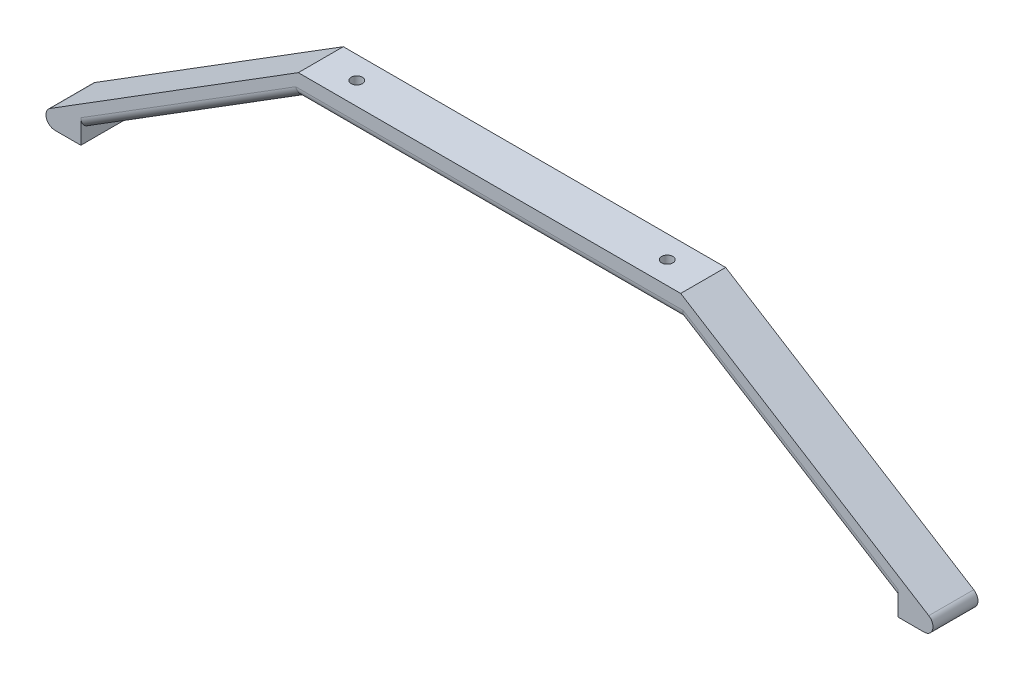
ISO-10303-21;
HEADER;
FILE_DESCRIPTION(('STEP AP214'),'2;1');
FILE_NAME('part.step','',(''),(''),'','','');
FILE_SCHEMA(('AUTOMOTIVE_DESIGN { 1 0 10303 214 1 1 1 1 }'));
ENDSEC;
DATA;
#1=APPLICATION_CONTEXT('core data for automotive mechanical design processes');
#2=APPLICATION_PROTOCOL_DEFINITION('international standard','automotive_design',2000,#1);
#3=PRODUCT_CONTEXT('',#1,'mechanical');
#4=PRODUCT('Part','Part','',(#3));
#5=PRODUCT_RELATED_PRODUCT_CATEGORY('part','',(#4));
#6=PRODUCT_DEFINITION_FORMATION('','',#4);
#7=PRODUCT_DEFINITION_CONTEXT('part definition',#1,'design');
#8=PRODUCT_DEFINITION('design','',#6,#7);
#9=PRODUCT_DEFINITION_SHAPE('','',#8);
#10=(LENGTH_UNIT() NAMED_UNIT(*) SI_UNIT(.MILLI.,.METRE.));
#11=(NAMED_UNIT(*) PLANE_ANGLE_UNIT() SI_UNIT($,.RADIAN.));
#12=(NAMED_UNIT(*) SI_UNIT($,.STERADIAN.) SOLID_ANGLE_UNIT());
#13=UNCERTAINTY_MEASURE_WITH_UNIT(LENGTH_MEASURE(1.E-05),#10,'distance_accuracy_value','');
#14=(GEOMETRIC_REPRESENTATION_CONTEXT(3) GLOBAL_UNCERTAINTY_ASSIGNED_CONTEXT((#13)) GLOBAL_UNIT_ASSIGNED_CONTEXT((#10,
#11,#12)) REPRESENTATION_CONTEXT('',''));
#15=CARTESIAN_POINT('',(0.,0.,0.));
#16=DIRECTION('',(0.,0.,1.));
#17=DIRECTION('',(1.,0.,0.));
#18=AXIS2_PLACEMENT_3D('',#15,#16,#17);
#19=CARTESIAN_POINT('',(0.,0.,10.));
#20=DIRECTION('',(0.5299192642332,-0.848048096156429,0.));
#21=DIRECTION('',(0.848048096156429,0.5299192642332,0.));
#22=AXIS2_PLACEMENT_3D('',#19,#20,#21);
#23=PLANE('',#22);
#24=DIRECTION('',(-0.848048096156429,-0.5299192642332,0.));
#25=VECTOR('',#24,1.);
#26=CARTESIAN_POINT('',(0.,0.,0.));
#27=LINE('',#26,#25);
#28=CARTESIAN_POINT('',(0.,0.,0.));
#29=VERTEX_POINT('',#28);
#30=CARTESIAN_POINT('',(-55.1444725640473,-34.4580908324775,0.));
#31=VERTEX_POINT('',#30);
#32=EDGE_CURVE('E187',#29,#31,#27,.T.);
#33=ORIENTED_EDGE('',*,*,#32,.T.);
#34=DIRECTION('',(0.,0.,-1.));
#35=VECTOR('',#34,1.);
#36=CARTESIAN_POINT('',(-55.1444725640474,-34.4580908324775,10.));
#37=LINE('',#36,#35);
#38=CARTESIAN_POINT('',(-55.1444725640473,-34.4580908324775,10.));
#39=VERTEX_POINT('',#38);
#40=EDGE_CURVE('E272',#31,#39,#37,.F.);
#41=ORIENTED_EDGE('',*,*,#40,.T.);
#42=DIRECTION('',(-0.848048096156429,-0.5299192642332,0.));
#43=VECTOR('',#42,1.);
#44=CARTESIAN_POINT('',(0.,0.,10.));
#45=LINE('',#44,#43);
#46=CARTESIAN_POINT('',(0.,0.,10.));
#47=VERTEX_POINT('',#46);
#48=EDGE_CURVE('E158',#47,#39,#45,.T.);
#49=ORIENTED_EDGE('',*,*,#48,.F.);
#50=DIRECTION('',(0.,0.,-1.));
#51=VECTOR('',#50,1.);
#52=CARTESIAN_POINT('',(0.,0.,10.));
#53=LINE('',#52,#51);
#54=EDGE_CURVE('E186',#47,#29,#53,.T.);
#55=ORIENTED_EDGE('',*,*,#54,.T.);
#56=EDGE_LOOP('',(#33,#41,#49,#55));
#57=FACE_BOUND('',#56,.T.);
#58=ADVANCED_FACE('F33',(#57),#23,.F.);
#59=CARTESIAN_POINT('',(-61.0594629232629,-38.1541870247904,10.));
#60=DIRECTION('',(0.,1.,0.));
#61=DIRECTION('',(0.,0.,1.));
#62=AXIS2_PLACEMENT_3D('',#59,#60,#61);
#63=PLANE('',#62);
#64=DIRECTION('',(1.,0.,0.));
#65=VECTOR('',#64,1.);
#66=CARTESIAN_POINT('',(-61.0594629232629,-38.1541870247904,10.));
#67=LINE('',#66,#65);
#68=CARTESIAN_POINT('',(-54.084634035581,-38.1541870247904,10.));
#69=VERTEX_POINT('',#68);
#70=CARTESIAN_POINT('',(-48.3387414809165,-38.1541870247904,10.));
#71=VERTEX_POINT('',#70);
#72=EDGE_CURVE('E145',#69,#71,#67,.T.);
#73=ORIENTED_EDGE('',*,*,#72,.F.);
#74=DIRECTION('',(0.,0.,-1.));
#75=VECTOR('',#74,1.);
#76=CARTESIAN_POINT('',(-54.084634035581,-38.1541870247904,10.));
#77=LINE('',#76,#75);
#78=CARTESIAN_POINT('',(-54.084634035581,-38.1541870247904,0.));
#79=VERTEX_POINT('',#78);
#80=EDGE_CURVE('E261',#69,#79,#77,.T.);
#81=ORIENTED_EDGE('',*,*,#80,.T.);
#82=DIRECTION('',(1.,0.,0.));
#83=VECTOR('',#82,1.);
#84=CARTESIAN_POINT('',(-61.0594629232629,-38.1541870247904,0.));
#85=LINE('',#84,#83);
#86=CARTESIAN_POINT('',(-48.3387414809165,-38.1541870247904,0.));
#87=VERTEX_POINT('',#86);
#88=EDGE_CURVE('E164',#79,#87,#85,.T.);
#89=ORIENTED_EDGE('',*,*,#88,.T.);
#90=DIRECTION('',(0.,0.,-1.));
#91=VECTOR('',#90,1.);
#92=CARTESIAN_POINT('',(-48.3387414809165,-38.1541870247904,10.));
#93=LINE('',#92,#91);
#94=EDGE_CURVE('E161',#71,#87,#93,.T.);
#95=ORIENTED_EDGE('',*,*,#94,.F.);
#96=EDGE_LOOP('',(#73,#81,#89,#95));
#97=FACE_BOUND('',#96,.T.);
#98=ADVANCED_FACE('F162',(#97),#63,.F.);
#99=CARTESIAN_POINT('',(-48.3387414809165,-38.1541870247904,10.));
#100=DIRECTION('',(-1.,0.,0.));
#101=DIRECTION('',(0.,0.,1.));
#102=AXIS2_PLACEMENT_3D('',#99,#100,#101);
#103=PLANE('',#102);
#104=DIRECTION('',(0.,1.,0.));
#105=VECTOR('',#104,1.);
#106=CARTESIAN_POINT('',(-48.3387414809165,-38.1541870247904,0.));
#107=LINE('',#106,#105);
#108=CARTESIAN_POINT('',(-48.3387414809165,-32.8470412545682,0.));
#109=VERTEX_POINT('',#108);
#110=EDGE_CURVE('E192',#87,#109,#107,.T.);
#111=ORIENTED_EDGE('',*,*,#110,.T.);
#112=CARTESIAN_POINT('',(-48.3387414809165,-32.8470412545682,2.));
#113=DIRECTION('',(-1.,0.,0.));
#114=DIRECTION('',(0.,1.,0.));
#115=AXIS2_PLACEMENT_3D('',#112,#113,#114);
#116=ELLIPSE('',#115,2.35835680672418,2.);
#117=CARTESIAN_POINT('',(-48.3387414809165,-35.2053980612924,2.));
#118=VERTEX_POINT('',#117);
#119=EDGE_CURVE('E259',#109,#118,#116,.T.);
#120=ORIENTED_EDGE('',*,*,#119,.T.);
#121=DIRECTION('',(0.,0.,-1.));
#122=VECTOR('',#121,1.);
#123=CARTESIAN_POINT('',(-48.3387414809165,-35.2053980612924,10.));
#124=LINE('',#123,#122);
#125=CARTESIAN_POINT('',(-48.3387414809165,-35.2053980612924,8.));
#126=VERTEX_POINT('',#125);
#127=EDGE_CURVE('E168',#126,#118,#124,.T.);
#128=ORIENTED_EDGE('',*,*,#127,.F.);
#129=CARTESIAN_POINT('',(-48.3387414809165,-32.8470412545682,8.));
#130=DIRECTION('',(-1.,0.,0.));
#131=DIRECTION('',(0.,-1.,0.));
#132=AXIS2_PLACEMENT_3D('',#129,#130,#131);
#133=ELLIPSE('',#132,2.35835680672418,2.);
#134=CARTESIAN_POINT('',(-48.3387414809165,-32.8470412545682,10.));
#135=VERTEX_POINT('',#134);
#136=EDGE_CURVE('E173',#126,#135,#133,.T.);
#137=ORIENTED_EDGE('',*,*,#136,.T.);
#138=DIRECTION('',(0.,1.,0.));
#139=VECTOR('',#138,1.);
#140=CARTESIAN_POINT('',(-48.3387414809165,-38.1541870247904,10.));
#141=LINE('',#140,#139);
#142=EDGE_CURVE('E150',#71,#135,#141,.T.);
#143=ORIENTED_EDGE('',*,*,#142,.F.);
#144=ORIENTED_EDGE('',*,*,#94,.T.);
#145=EDGE_LOOP('',(#111,#120,#128,#137,#143,#144));
#146=FACE_BOUND('',#145,.T.);
#147=ADVANCED_FACE('F170',(#146),#103,.F.);
#148=CARTESIAN_POINT('',(0.,-5.,10.));
#149=DIRECTION('',(-0.5299192642332,0.848048096156429,0.));
#150=DIRECTION('',(-0.848048096156429,-0.5299192642332,0.));
#151=AXIS2_PLACEMENT_3D('',#148,#149,#150);
#152=PLANE('',#151);
#153=DIRECTION('',(0.,0.,-1.));
#154=VECTOR('',#153,1.);
#155=CARTESIAN_POINT('',(0.,-5.,10.));
#156=LINE('',#155,#154);
#157=CARTESIAN_POINT('',(0.,-5.,8.));
#158=VERTEX_POINT('',#157);
#159=CARTESIAN_POINT('',(0.,-5.,2.));
#160=VERTEX_POINT('',#159);
#161=EDGE_CURVE('E216',#158,#160,#156,.T.);
#162=ORIENTED_EDGE('',*,*,#161,.F.);
#163=DIRECTION('',(0.848048096156429,0.5299192642332,0.));
#164=VECTOR('',#163,1.);
#165=CARTESIAN_POINT('',(-48.3387414809165,-35.2053980612924,8.));
#166=LINE('',#165,#164);
#167=EDGE_CURVE('E244',#158,#126,#166,.F.);
#168=ORIENTED_EDGE('',*,*,#167,.T.);
#169=ORIENTED_EDGE('',*,*,#127,.T.);
#170=DIRECTION('',(0.848048096156429,0.5299192642332,0.));
#171=VECTOR('',#170,1.);
#172=CARTESIAN_POINT('',(0.,-5.,2.));
#173=LINE('',#172,#171);
#174=EDGE_CURVE('E242',#118,#160,#173,.T.);
#175=ORIENTED_EDGE('',*,*,#174,.T.);
#176=EDGE_LOOP('',(#162,#168,#169,#175));
#177=FACE_BOUND('',#176,.T.);
#178=ADVANCED_FACE('F325',(#177),#152,.F.);
#179=CARTESIAN_POINT('',(0.,-5.,10.));
#180=DIRECTION('',(0.,1.,0.));
#181=DIRECTION('',(0.,0.,1.));
#182=AXIS2_PLACEMENT_3D('',#179,#180,#181);
#183=PLANE('',#182);
#184=CARTESIAN_POINT('',(8.,-5.,5.));
#185=DIRECTION('',(0.,1.,0.));
#186=DIRECTION('',(0.,0.,1.));
#187=AXIS2_PLACEMENT_3D('',#184,#185,#186);
#188=CIRCLE('',#187,1.25);
#189=CARTESIAN_POINT('',(8.,-5.,6.25));
#190=VERTEX_POINT('',#189);
#191=EDGE_CURVE('E301',#190,#190,#188,.T.);
#192=ORIENTED_EDGE('',*,*,#191,.T.);
#193=EDGE_LOOP('',(#192));
#194=FACE_BOUND('',#193,.T.);
#195=CARTESIAN_POINT('',(77.,-5.,5.));
#196=DIRECTION('',(0.,1.,0.));
#197=DIRECTION('',(0.,0.,1.));
#198=AXIS2_PLACEMENT_3D('',#195,#196,#197);
#199=CIRCLE('',#198,1.25);
#200=CARTESIAN_POINT('',(77.,-5.,6.25));
#201=VERTEX_POINT('',#200);
#202=EDGE_CURVE('E190',#201,#201,#199,.T.);
#203=ORIENTED_EDGE('',*,*,#202,.T.);
#204=EDGE_LOOP('',(#203));
#205=FACE_BOUND('',#204,.T.);
#206=ORIENTED_EDGE('',*,*,#161,.T.);
#207=DIRECTION('',(1.,0.,0.));
#208=VECTOR('',#207,1.);
#209=CARTESIAN_POINT('',(0.,-5.,2.));
#210=LINE('',#209,#208);
#211=CARTESIAN_POINT('',(85.,-5.,2.));
#212=VERTEX_POINT('',#211);
#213=EDGE_CURVE('E246',#160,#212,#210,.T.);
#214=ORIENTED_EDGE('',*,*,#213,.T.);
#215=DIRECTION('',(0.,0.,-1.));
#216=VECTOR('',#215,1.);
#217=CARTESIAN_POINT('',(85.,-5.,10.));
#218=LINE('',#217,#216);
#219=CARTESIAN_POINT('',(85.,-5.,8.));
#220=VERTEX_POINT('',#219);
#221=EDGE_CURVE('E213',#220,#212,#218,.T.);
#222=ORIENTED_EDGE('',*,*,#221,.F.);
#223=DIRECTION('',(1.,0.,0.));
#224=VECTOR('',#223,1.);
#225=CARTESIAN_POINT('',(0.,-5.,8.));
#226=LINE('',#225,#224);
#227=EDGE_CURVE('E222',#220,#158,#226,.F.);
#228=ORIENTED_EDGE('',*,*,#227,.T.);
#229=EDGE_LOOP('',(#206,#214,#222,#228));
#230=FACE_BOUND('',#229,.T.);
#231=ADVANCED_FACE('F321',(#194,#205,#230),#183,.F.);
#232=CARTESIAN_POINT('',(85.,-5.,10.));
#233=DIRECTION('',(0.529919264233206,0.848048096156425,0.));
#234=DIRECTION('',(-0.848048096156425,0.529919264233206,0.));
#235=AXIS2_PLACEMENT_3D('',#232,#233,#234);
#236=PLANE('',#235);
#237=DIRECTION('',(0.,0.,-1.));
#238=VECTOR('',#237,1.);
#239=CARTESIAN_POINT('',(133.338741480916,-35.2053980612927,10.));
#240=LINE('',#239,#238);
#241=CARTESIAN_POINT('',(133.338741480916,-35.2053980612927,8.));
#242=VERTEX_POINT('',#241);
#243=CARTESIAN_POINT('',(133.338741480916,-35.2053980612927,2.));
#244=VERTEX_POINT('',#243);
#245=EDGE_CURVE('E210',#242,#244,#240,.T.);
#246=ORIENTED_EDGE('',*,*,#245,.F.);
#247=DIRECTION('',(0.848048096156425,-0.529919264233206,0.));
#248=VECTOR('',#247,1.);
#249=CARTESIAN_POINT('',(81.7993309419179,-3.,8.));
#250=LINE('',#249,#248);
#251=EDGE_CURVE('E233',#242,#220,#250,.F.);
#252=ORIENTED_EDGE('',*,*,#251,.T.);
#253=ORIENTED_EDGE('',*,*,#221,.T.);
#254=DIRECTION('',(0.848048096156425,-0.529919264233206,0.));
#255=VECTOR('',#254,1.);
#256=CARTESIAN_POINT('',(85.,-5.,2.));
#257=LINE('',#256,#255);
#258=EDGE_CURVE('E230',#212,#244,#257,.T.);
#259=ORIENTED_EDGE('',*,*,#258,.T.);
#260=EDGE_LOOP('',(#246,#252,#253,#259));
#261=FACE_BOUND('',#260,.T.);
#262=ADVANCED_FACE('F324',(#261),#236,.F.);
#263=CARTESIAN_POINT('',(133.338741480916,-35.2053980612927,10.));
#264=DIRECTION('',(1.,0.,0.));
#265=DIRECTION('',(0.,0.,-1.));
#266=AXIS2_PLACEMENT_3D('',#263,#264,#265);
#267=PLANE('',#266);
#268=DIRECTION('',(0.,-1.,0.));
#269=VECTOR('',#268,1.);
#270=CARTESIAN_POINT('',(133.338741480916,-35.2053980612927,0.));
#271=LINE('',#270,#269);
#272=CARTESIAN_POINT('',(133.338741480916,-32.8470412545685,0.));
#273=VERTEX_POINT('',#272);
#274=CARTESIAN_POINT('',(133.338741480916,-38.1541870247908,0.));
#275=VERTEX_POINT('',#274);
#276=EDGE_CURVE('E194',#273,#275,#271,.T.);
#277=ORIENTED_EDGE('',*,*,#276,.T.);
#278=DIRECTION('',(0.,0.,-1.));
#279=VECTOR('',#278,1.);
#280=CARTESIAN_POINT('',(133.338741480916,-38.1541870247908,10.));
#281=LINE('',#280,#279);
#282=CARTESIAN_POINT('',(133.338741480916,-38.1541870247908,10.));
#283=VERTEX_POINT('',#282);
#284=EDGE_CURVE('E207',#283,#275,#281,.T.);
#285=ORIENTED_EDGE('',*,*,#284,.F.);
#286=DIRECTION('',(0.,-1.,0.));
#287=VECTOR('',#286,1.);
#288=CARTESIAN_POINT('',(133.338741480916,-35.2053980612927,10.));
#289=LINE('',#288,#287);
#290=CARTESIAN_POINT('',(133.338741480916,-32.8470412545685,10.));
#291=VERTEX_POINT('',#290);
#292=EDGE_CURVE('E175',#291,#283,#289,.T.);
#293=ORIENTED_EDGE('',*,*,#292,.F.);
#294=CARTESIAN_POINT('',(133.338741480916,-32.8470412545685,8.));
#295=DIRECTION('',(1.,0.,0.));
#296=DIRECTION('',(0.,1.,0.));
#297=AXIS2_PLACEMENT_3D('',#294,#295,#296);
#298=ELLIPSE('',#297,2.35835680672419,2.);
#299=EDGE_CURVE('E248',#291,#242,#298,.T.);
#300=ORIENTED_EDGE('',*,*,#299,.T.);
#301=ORIENTED_EDGE('',*,*,#245,.T.);
#302=CARTESIAN_POINT('',(133.338741480916,-32.8470412545685,2.));
#303=DIRECTION('',(1.,0.,0.));
#304=DIRECTION('',(0.,-1.,0.));
#305=AXIS2_PLACEMENT_3D('',#302,#303,#304);
#306=ELLIPSE('',#305,2.35835680672419,2.);
#307=EDGE_CURVE('E253',#244,#273,#306,.T.);
#308=ORIENTED_EDGE('',*,*,#307,.T.);
#309=EDGE_LOOP('',(#277,#285,#293,#300,#301,#308));
#310=FACE_BOUND('',#309,.T.);
#311=ADVANCED_FACE('F352',(#310),#267,.F.);
#312=CARTESIAN_POINT('',(133.338741480916,-38.1541870247908,10.));
#313=DIRECTION('',(0.,1.,0.));
#314=DIRECTION('',(-1.,0.,0.));
#315=AXIS2_PLACEMENT_3D('',#312,#313,#314);
#316=PLANE('',#315);
#317=DIRECTION('',(1.,0.,0.));
#318=VECTOR('',#317,1.);
#319=CARTESIAN_POINT('',(133.338741480916,-38.1541870247908,0.));
#320=LINE('',#319,#318);
#321=CARTESIAN_POINT('',(139.084634035581,-38.1541870247908,0.));
#322=VERTEX_POINT('',#321);
#323=EDGE_CURVE('E196',#275,#322,#320,.T.);
#324=ORIENTED_EDGE('',*,*,#323,.T.);
#325=DIRECTION('',(0.,0.,-1.));
#326=VECTOR('',#325,1.);
#327=CARTESIAN_POINT('',(139.084634035581,-38.1541870247908,10.));
#328=LINE('',#327,#326);
#329=CARTESIAN_POINT('',(139.084634035581,-38.1541870247908,10.));
#330=VERTEX_POINT('',#329);
#331=EDGE_CURVE('E41',#322,#330,#328,.F.);
#332=ORIENTED_EDGE('',*,*,#331,.T.);
#333=DIRECTION('',(1.,0.,0.));
#334=VECTOR('',#333,1.);
#335=CARTESIAN_POINT('',(133.338741480916,-38.1541870247908,10.));
#336=LINE('',#335,#334);
#337=EDGE_CURVE('E177',#283,#330,#336,.T.);
#338=ORIENTED_EDGE('',*,*,#337,.F.);
#339=ORIENTED_EDGE('',*,*,#284,.T.);
#340=EDGE_LOOP('',(#324,#332,#338,#339));
#341=FACE_BOUND('',#340,.T.);
#342=ADVANCED_FACE('F364',(#341),#316,.F.);
#343=CARTESIAN_POINT('',(85.,0.,10.));
#344=DIRECTION('',(-0.529919264233206,-0.848048096156425,0.));
#345=DIRECTION('',(0.848048096156425,-0.529919264233206,0.));
#346=AXIS2_PLACEMENT_3D('',#343,#344,#345);
#347=PLANE('',#346);
#348=DIRECTION('',(-0.848048096156425,0.529919264233206,0.));
#349=VECTOR('',#348,1.);
#350=CARTESIAN_POINT('',(85.,0.,10.));
#351=LINE('',#350,#349);
#352=CARTESIAN_POINT('',(140.144472564047,-34.458090832478,10.));
#353=VERTEX_POINT('',#352);
#354=CARTESIAN_POINT('',(85.,0.,10.));
#355=VERTEX_POINT('',#354);
#356=EDGE_CURVE('E182',#353,#355,#351,.T.);
#357=ORIENTED_EDGE('',*,*,#356,.F.);
#358=DIRECTION('',(0.,0.,-1.));
#359=VECTOR('',#358,1.);
#360=CARTESIAN_POINT('',(140.144472564047,-34.458090832478,10.));
#361=LINE('',#360,#359);
#362=CARTESIAN_POINT('',(140.144472564047,-34.458090832478,0.));
#363=VERTEX_POINT('',#362);
#364=EDGE_CURVE('E275',#353,#363,#361,.T.);
#365=ORIENTED_EDGE('',*,*,#364,.T.);
#366=DIRECTION('',(-0.848048096156425,0.529919264233206,0.));
#367=VECTOR('',#366,1.);
#368=CARTESIAN_POINT('',(85.,0.,0.));
#369=LINE('',#368,#367);
#370=CARTESIAN_POINT('',(85.,0.,0.));
#371=VERTEX_POINT('',#370);
#372=EDGE_CURVE('E198',#363,#371,#369,.T.);
#373=ORIENTED_EDGE('',*,*,#372,.T.);
#374=DIRECTION('',(0.,0.,-1.));
#375=VECTOR('',#374,1.);
#376=CARTESIAN_POINT('',(85.,0.,10.));
#377=LINE('',#376,#375);
#378=EDGE_CURVE('E204',#355,#371,#377,.T.);
#379=ORIENTED_EDGE('',*,*,#378,.F.);
#380=EDGE_LOOP('',(#357,#365,#373,#379));
#381=FACE_BOUND('',#380,.T.);
#382=ADVANCED_FACE('F281',(#381),#347,.F.);
#383=CARTESIAN_POINT('',(0.,0.,10.));
#384=DIRECTION('',(0.,-1.,0.));
#385=DIRECTION('',(0.,0.,-1.));
#386=AXIS2_PLACEMENT_3D('',#383,#384,#385);
#387=PLANE('',#386);
#388=CARTESIAN_POINT('',(8.,0.,5.));
#389=DIRECTION('',(0.,1.,0.));
#390=DIRECTION('',(0.,0.,1.));
#391=AXIS2_PLACEMENT_3D('',#388,#389,#390);
#392=CIRCLE('',#391,1.25);
#393=CARTESIAN_POINT('',(8.,0.,6.25));
#394=VERTEX_POINT('',#393);
#395=EDGE_CURVE('E268',#394,#394,#392,.T.);
#396=ORIENTED_EDGE('',*,*,#395,.F.);
#397=EDGE_LOOP('',(#396));
#398=FACE_BOUND('',#397,.T.);
#399=CARTESIAN_POINT('',(77.,0.,5.));
#400=DIRECTION('',(0.,1.,0.));
#401=DIRECTION('',(0.,0.,1.));
#402=AXIS2_PLACEMENT_3D('',#399,#400,#401);
#403=CIRCLE('',#402,1.25);
#404=CARTESIAN_POINT('',(77.,0.,6.25));
#405=VERTEX_POINT('',#404);
#406=EDGE_CURVE('E298',#405,#405,#403,.T.);
#407=ORIENTED_EDGE('',*,*,#406,.F.);
#408=EDGE_LOOP('',(#407));
#409=FACE_BOUND('',#408,.T.);
#410=DIRECTION('',(-1.,0.,0.));
#411=VECTOR('',#410,1.);
#412=CARTESIAN_POINT('',(0.,0.,0.));
#413=LINE('',#412,#411);
#414=EDGE_CURVE('E200',#371,#29,#413,.T.);
#415=ORIENTED_EDGE('',*,*,#414,.T.);
#416=ORIENTED_EDGE('',*,*,#54,.F.);
#417=DIRECTION('',(-1.,0.,0.));
#418=VECTOR('',#417,1.);
#419=CARTESIAN_POINT('',(0.,0.,10.));
#420=LINE('',#419,#418);
#421=EDGE_CURVE('E184',#355,#47,#420,.T.);
#422=ORIENTED_EDGE('',*,*,#421,.F.);
#423=ORIENTED_EDGE('',*,*,#378,.T.);
#424=EDGE_LOOP('',(#415,#416,#422,#423));
#425=FACE_BOUND('',#424,.T.);
#426=ADVANCED_FACE('F290',(#398,#409,#425),#387,.F.);
#427=CARTESIAN_POINT('',(0.,0.,10.));
#428=DIRECTION('',(0.,0.,1.));
#429=DIRECTION('',(1.,0.,0.));
#430=AXIS2_PLACEMENT_3D('',#427,#428,#429);
#431=PLANE('',#430);
#432=ORIENTED_EDGE('',*,*,#337,.T.);
#433=CARTESIAN_POINT('',(139.084634035581,-36.1541870247908,10.));
#434=DIRECTION('',(0.,0.,1.));
#435=DIRECTION('',(1.,0.,0.));
#436=AXIS2_PLACEMENT_3D('',#433,#434,#435);
#437=CIRCLE('',#436,2.);
#438=EDGE_CURVE('E11',#330,#353,#437,.T.);
#439=ORIENTED_EDGE('',*,*,#438,.T.);
#440=ORIENTED_EDGE('',*,*,#356,.T.);
#441=ORIENTED_EDGE('',*,*,#421,.T.);
#442=ORIENTED_EDGE('',*,*,#48,.T.);
#443=CARTESIAN_POINT('',(-54.084634035581,-36.1541870247904,10.));
#444=DIRECTION('',(0.,0.,1.));
#445=DIRECTION('',(1.,0.,0.));
#446=AXIS2_PLACEMENT_3D('',#443,#444,#445);
#447=CIRCLE('',#446,2.);
#448=EDGE_CURVE('E154',#39,#69,#447,.T.);
#449=ORIENTED_EDGE('',*,*,#448,.T.);
#450=ORIENTED_EDGE('',*,*,#72,.T.);
#451=ORIENTED_EDGE('',*,*,#142,.T.);
#452=DIRECTION('',(0.848048096156429,0.5299192642332,0.));
#453=VECTOR('',#452,1.);
#454=CARTESIAN_POINT('',(2.14083052961574,-1.30390380768714,10.));
#455=LINE('',#454,#453);
#456=CARTESIAN_POINT('',(-0.57349077151761,-3.,10.));
#457=VERTEX_POINT('',#456);
#458=EDGE_CURVE('E225',#135,#457,#455,.T.);
#459=ORIENTED_EDGE('',*,*,#458,.T.);
#460=DIRECTION('',(1.,0.,0.));
#461=VECTOR('',#460,1.);
#462=CARTESIAN_POINT('',(85.,-3.,10.));
#463=LINE('',#462,#461);
#464=CARTESIAN_POINT('',(85.5734907715176,-3.,10.));
#465=VERTEX_POINT('',#464);
#466=EDGE_CURVE('E167',#457,#465,#463,.T.);
#467=ORIENTED_EDGE('',*,*,#466,.T.);
#468=DIRECTION('',(0.848048096156425,-0.529919264233206,0.));
#469=VECTOR('',#468,1.);
#470=CARTESIAN_POINT('',(134.398580009383,-33.5093018689799,10.));
#471=LINE('',#470,#469);
#472=EDGE_CURVE('E227',#465,#291,#471,.T.);
#473=ORIENTED_EDGE('',*,*,#472,.T.);
#474=ORIENTED_EDGE('',*,*,#292,.T.);
#475=EDGE_LOOP('',(#432,#439,#440,#441,#442,#449,#450,#451,#459,#467,#473,#474));
#476=FACE_BOUND('',#475,.T.);
#477=ADVANCED_FACE('F147',(#476),#431,.T.);
#478=CARTESIAN_POINT('',(0.,0.,0.));
#479=DIRECTION('',(0.,0.,1.));
#480=DIRECTION('',(1.,0.,0.));
#481=AXIS2_PLACEMENT_3D('',#478,#479,#480);
#482=PLANE('',#481);
#483=ORIENTED_EDGE('',*,*,#372,.F.);
#484=CARTESIAN_POINT('',(139.084634035581,-36.1541870247908,0.));
#485=DIRECTION('',(0.,0.,1.));
#486=DIRECTION('',(1.,0.,0.));
#487=AXIS2_PLACEMENT_3D('',#484,#485,#486);
#488=CIRCLE('',#487,2.);
#489=EDGE_CURVE('E55',#363,#322,#488,.F.);
#490=ORIENTED_EDGE('',*,*,#489,.T.);
#491=ORIENTED_EDGE('',*,*,#323,.F.);
#492=ORIENTED_EDGE('',*,*,#276,.F.);
#493=DIRECTION('',(0.848048096156425,-0.529919264233206,0.));
#494=VECTOR('',#493,1.);
#495=CARTESIAN_POINT('',(22.6820796741828,36.2989152930548,0.));
#496=LINE('',#495,#494);
#497=CARTESIAN_POINT('',(85.5734907715176,-3.,0.));
#498=VERTEX_POINT('',#497);
#499=EDGE_CURVE('E240',#273,#498,#496,.F.);
#500=ORIENTED_EDGE('',*,*,#499,.T.);
#501=DIRECTION('',(1.,0.,0.));
#502=VECTOR('',#501,1.);
#503=CARTESIAN_POINT('',(0.,-3.,0.));
#504=LINE('',#503,#502);
#505=CARTESIAN_POINT('',(-0.573490771517616,-3.,0.));
#506=VERTEX_POINT('',#505);
#507=EDGE_CURVE('E235',#498,#506,#504,.F.);
#508=ORIENTED_EDGE('',*,*,#507,.T.);
#509=DIRECTION('',(0.848048096156429,0.5299192642332,0.));
#510=VECTOR('',#509,1.);
#511=CARTESIAN_POINT('',(1.1871465872815,-1.89983167465986,0.));
#512=LINE('',#511,#510);
#513=EDGE_CURVE('E237',#506,#109,#512,.F.);
#514=ORIENTED_EDGE('',*,*,#513,.T.);
#515=ORIENTED_EDGE('',*,*,#110,.F.);
#516=ORIENTED_EDGE('',*,*,#88,.F.);
#517=CARTESIAN_POINT('',(-54.084634035581,-36.1541870247904,0.));
#518=DIRECTION('',(0.,0.,1.));
#519=DIRECTION('',(1.,0.,0.));
#520=AXIS2_PLACEMENT_3D('',#517,#518,#519);
#521=CIRCLE('',#520,2.);
#522=EDGE_CURVE('E270',#79,#31,#521,.F.);
#523=ORIENTED_EDGE('',*,*,#522,.T.);
#524=ORIENTED_EDGE('',*,*,#32,.F.);
#525=ORIENTED_EDGE('',*,*,#414,.F.);
#526=EDGE_LOOP('',(#483,#490,#491,#492,#500,#508,#514,#515,#516,#523,#524,#525));
#527=FACE_BOUND('',#526,.T.);
#528=ADVANCED_FACE('F286',(#527),#482,.F.);
#529=CARTESIAN_POINT('',(77.,-10.,5.));
#530=DIRECTION('',(0.,1.,0.));
#531=DIRECTION('',(0.,0.,1.));
#532=AXIS2_PLACEMENT_3D('',#529,#530,#531);
#533=CYLINDRICAL_SURFACE('',#532,1.25);
#534=ORIENTED_EDGE('',*,*,#406,.T.);
#535=EDGE_LOOP('',(#534));
#536=FACE_BOUND('',#535,.T.);
#537=ORIENTED_EDGE('',*,*,#202,.F.);
#538=EDGE_LOOP('',(#537));
#539=FACE_BOUND('',#538,.T.);
#540=ADVANCED_FACE('F315',(#536,#539),#533,.F.);
#541=CARTESIAN_POINT('',(8.,-10.,5.));
#542=DIRECTION('',(0.,1.,0.));
#543=DIRECTION('',(0.,0.,1.));
#544=AXIS2_PLACEMENT_3D('',#541,#542,#543);
#545=CYLINDRICAL_SURFACE('',#544,1.25);
#546=ORIENTED_EDGE('',*,*,#395,.T.);
#547=EDGE_LOOP('',(#546));
#548=FACE_BOUND('',#547,.T.);
#549=ORIENTED_EDGE('',*,*,#191,.F.);
#550=EDGE_LOOP('',(#549));
#551=FACE_BOUND('',#550,.T.);
#552=ADVANCED_FACE('F307',(#548,#551),#545,.F.);
#553=CARTESIAN_POINT('',(0.,-3.,8.));
#554=DIRECTION('',(-1.,0.,0.));
#555=DIRECTION('',(0.,0.,1.));
#556=AXIS2_PLACEMENT_3D('',#553,#554,#555);
#557=CYLINDRICAL_SURFACE('',#556,2.);
#558=ORIENTED_EDGE('',*,*,#466,.F.);
#559=CARTESIAN_POINT('',(-0.573490771517609,-3.,8.));
#560=DIRECTION('',(-0.96126169593832,-0.275637355816996,0.));
#561=DIRECTION('',(0.275637355816996,-0.96126169593832,0.));
#562=AXIS2_PLACEMENT_3D('',#559,#560,#561);
#563=ELLIPSE('',#562,2.0805988717232,2.);
#564=EDGE_CURVE('E256',#457,#158,#563,.F.);
#565=ORIENTED_EDGE('',*,*,#564,.T.);
#566=ORIENTED_EDGE('',*,*,#227,.F.);
#567=CARTESIAN_POINT('',(85.5734907715176,-3.,8.));
#568=DIRECTION('',(-0.961261695938319,0.275637355817,0.));
#569=DIRECTION('',(0.275637355817,0.961261695938319,0.));
#570=AXIS2_PLACEMENT_3D('',#567,#568,#569);
#571=ELLIPSE('',#570,2.0805988717232,2.);
#572=EDGE_CURVE('E250',#220,#465,#571,.T.);
#573=ORIENTED_EDGE('',*,*,#572,.T.);
#574=EDGE_LOOP('',(#558,#565,#566,#573));
#575=FACE_BOUND('',#574,.T.);
#576=ADVANCED_FACE('F361',(#575),#557,.T.);
#577=CARTESIAN_POINT('',(22.6820796741828,36.2989152930548,8.));
#578=DIRECTION('',(-0.848048096156425,0.529919264233206,0.));
#579=DIRECTION('',(-0.529919264233206,-0.848048096156425,0.));
#580=AXIS2_PLACEMENT_3D('',#577,#578,#579);
#581=CYLINDRICAL_SURFACE('',#580,2.);
#582=ORIENTED_EDGE('',*,*,#572,.F.);
#583=ORIENTED_EDGE('',*,*,#251,.F.);
#584=ORIENTED_EDGE('',*,*,#299,.F.);
#585=ORIENTED_EDGE('',*,*,#472,.F.);
#586=EDGE_LOOP('',(#582,#583,#584,#585));
#587=FACE_BOUND('',#586,.T.);
#588=ADVANCED_FACE('F358',(#587),#581,.T.);
#589=CARTESIAN_POINT('',(-1.0598385284664,-3.30390380768714,2.));
#590=DIRECTION('',(0.848048096156429,0.5299192642332,0.));
#591=DIRECTION('',(-0.5299192642332,0.848048096156429,0.));
#592=AXIS2_PLACEMENT_3D('',#589,#590,#591);
#593=CYLINDRICAL_SURFACE('',#592,2.);
#594=ORIENTED_EDGE('',*,*,#119,.F.);
#595=ORIENTED_EDGE('',*,*,#513,.F.);
#596=CARTESIAN_POINT('',(-0.57349077151761,-3.,2.));
#597=DIRECTION('',(0.96126169593832,0.275637355816996,0.));
#598=DIRECTION('',(-0.275637355816996,0.96126169593832,0.));
#599=AXIS2_PLACEMENT_3D('',#596,#597,#598);
#600=ELLIPSE('',#599,2.0805988717232,2.);
#601=EDGE_CURVE('E265',#160,#506,#600,.T.);
#602=ORIENTED_EDGE('',*,*,#601,.F.);
#603=ORIENTED_EDGE('',*,*,#174,.F.);
#604=EDGE_LOOP('',(#594,#595,#602,#603));
#605=FACE_BOUND('',#604,.T.);
#606=ADVANCED_FACE('F339',(#605),#593,.T.);
#607=CARTESIAN_POINT('',(0.,-3.,2.));
#608=DIRECTION('',(1.,0.,0.));
#609=DIRECTION('',(0.,0.,-1.));
#610=AXIS2_PLACEMENT_3D('',#607,#608,#609);
#611=CYLINDRICAL_SURFACE('',#610,2.);
#612=ORIENTED_EDGE('',*,*,#601,.T.);
#613=ORIENTED_EDGE('',*,*,#507,.F.);
#614=CARTESIAN_POINT('',(85.5734907715176,-2.99999999999999,2.));
#615=DIRECTION('',(0.961261695938319,-0.275637355817,0.));
#616=DIRECTION('',(-0.275637355817,-0.961261695938319,0.));
#617=AXIS2_PLACEMENT_3D('',#614,#615,#616);
#618=ELLIPSE('',#617,2.0805988717232,2.);
#619=EDGE_CURVE('E262',#212,#498,#618,.T.);
#620=ORIENTED_EDGE('',*,*,#619,.F.);
#621=ORIENTED_EDGE('',*,*,#213,.F.);
#622=EDGE_LOOP('',(#612,#613,#620,#621));
#623=FACE_BOUND('',#622,.T.);
#624=ADVANCED_FACE('F343',(#623),#611,.T.);
#625=CARTESIAN_POINT('',(86.0598385284664,-3.30390380768715,2.));
#626=DIRECTION('',(0.848048096156425,-0.529919264233206,0.));
#627=DIRECTION('',(0.529919264233206,0.848048096156425,0.));
#628=AXIS2_PLACEMENT_3D('',#625,#626,#627);
#629=CYLINDRICAL_SURFACE('',#628,2.);
#630=ORIENTED_EDGE('',*,*,#619,.T.);
#631=ORIENTED_EDGE('',*,*,#499,.F.);
#632=ORIENTED_EDGE('',*,*,#307,.F.);
#633=ORIENTED_EDGE('',*,*,#258,.F.);
#634=EDGE_LOOP('',(#630,#631,#632,#633));
#635=FACE_BOUND('',#634,.T.);
#636=ADVANCED_FACE('F347',(#635),#629,.T.);
#637=CARTESIAN_POINT('',(1.18714658728151,-1.89983167465986,8.));
#638=DIRECTION('',(-0.848048096156429,-0.5299192642332,0.));
#639=DIRECTION('',(0.5299192642332,-0.848048096156429,0.));
#640=AXIS2_PLACEMENT_3D('',#637,#638,#639);
#641=CYLINDRICAL_SURFACE('',#640,2.);
#642=ORIENTED_EDGE('',*,*,#136,.F.);
#643=ORIENTED_EDGE('',*,*,#167,.F.);
#644=ORIENTED_EDGE('',*,*,#564,.F.);
#645=ORIENTED_EDGE('',*,*,#458,.F.);
#646=EDGE_LOOP('',(#642,#643,#644,#645));
#647=FACE_BOUND('',#646,.T.);
#648=ADVANCED_FACE('F363',(#647),#641,.T.);
#649=CARTESIAN_POINT('',(-54.084634035581,-36.1541870247904,10.));
#650=DIRECTION('',(0.,0.,-1.));
#651=DIRECTION('',(-1.,0.,0.));
#652=AXIS2_PLACEMENT_3D('',#649,#650,#651);
#653=CYLINDRICAL_SURFACE('',#652,2.);
#654=ORIENTED_EDGE('',*,*,#448,.F.);
#655=ORIENTED_EDGE('',*,*,#40,.F.);
#656=ORIENTED_EDGE('',*,*,#522,.F.);
#657=ORIENTED_EDGE('',*,*,#80,.F.);
#658=EDGE_LOOP('',(#654,#655,#656,#657));
#659=FACE_BOUND('',#658,.T.);
#660=ADVANCED_FACE('F366',(#659),#653,.T.);
#661=CARTESIAN_POINT('',(139.084634035581,-36.1541870247908,10.));
#662=DIRECTION('',(0.,0.,-1.));
#663=DIRECTION('',(-1.,0.,0.));
#664=AXIS2_PLACEMENT_3D('',#661,#662,#663);
#665=CYLINDRICAL_SURFACE('',#664,2.);
#666=ORIENTED_EDGE('',*,*,#438,.F.);
#667=ORIENTED_EDGE('',*,*,#331,.F.);
#668=ORIENTED_EDGE('',*,*,#489,.F.);
#669=ORIENTED_EDGE('',*,*,#364,.F.);
#670=EDGE_LOOP('',(#666,#667,#668,#669));
#671=FACE_BOUND('',#670,.T.);
#672=ADVANCED_FACE('F35',(#671),#665,.T.);
#673=CLOSED_SHELL('',(#58,#98,#147,#178,#231,#262,#311,#342,#382,#426,#477,#528,#540,#552,#576,
#588,#606,#624,#636,#648,#660,#672));
#674=MANIFOLD_SOLID_BREP('B2',#673);
#675=ADVANCED_BREP_SHAPE_REPRESENTATION('',(#18,#674),#14);
#676=SHAPE_DEFINITION_REPRESENTATION(#9,#675);
ENDSEC;
END-ISO-10303-21;
